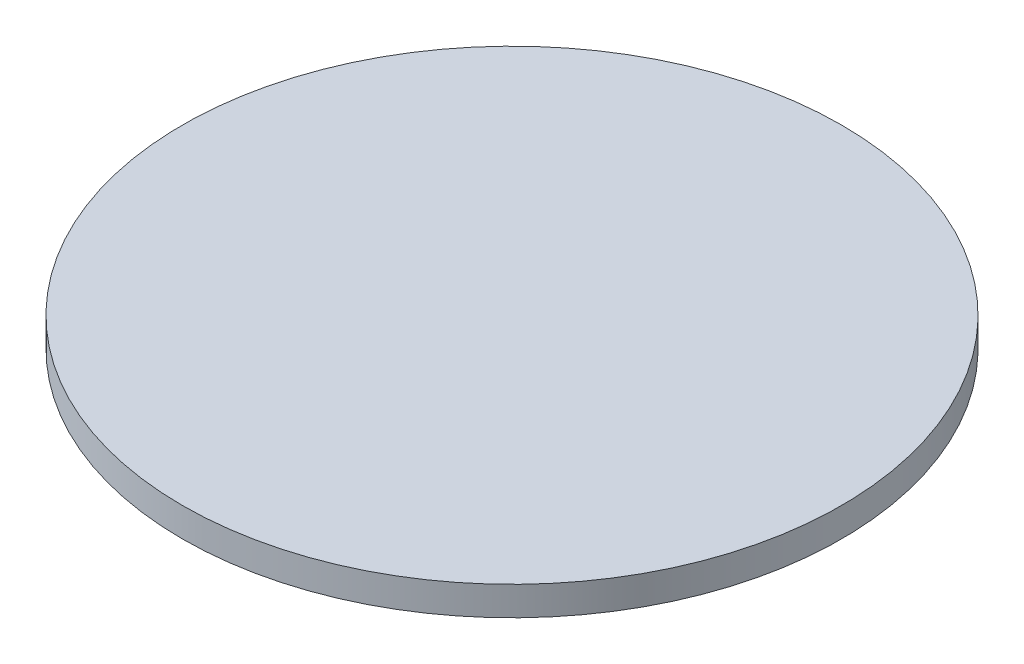
ISO-10303-21;
HEADER;
FILE_DESCRIPTION(('STEP AP214'),'2;1');
FILE_NAME('part.step','',(''),(''),'','','');
FILE_SCHEMA(('AUTOMOTIVE_DESIGN { 1 0 10303 214 1 1 1 1 }'));
ENDSEC;
DATA;
#1=APPLICATION_CONTEXT('core data for automotive mechanical design processes');
#2=APPLICATION_PROTOCOL_DEFINITION('international standard','automotive_design',2000,#1);
#3=PRODUCT_CONTEXT('',#1,'mechanical');
#4=PRODUCT('Part','Part','',(#3));
#5=PRODUCT_RELATED_PRODUCT_CATEGORY('part','',(#4));
#6=PRODUCT_DEFINITION_FORMATION('','',#4);
#7=PRODUCT_DEFINITION_CONTEXT('part definition',#1,'design');
#8=PRODUCT_DEFINITION('design','',#6,#7);
#9=PRODUCT_DEFINITION_SHAPE('','',#8);
#10=(LENGTH_UNIT() NAMED_UNIT(*) SI_UNIT(.MILLI.,.METRE.));
#11=(NAMED_UNIT(*) PLANE_ANGLE_UNIT() SI_UNIT($,.RADIAN.));
#12=(NAMED_UNIT(*) SI_UNIT($,.STERADIAN.) SOLID_ANGLE_UNIT());
#13=UNCERTAINTY_MEASURE_WITH_UNIT(LENGTH_MEASURE(1.E-05),#10,'distance_accuracy_value','');
#14=(GEOMETRIC_REPRESENTATION_CONTEXT(3) GLOBAL_UNCERTAINTY_ASSIGNED_CONTEXT((#13)) GLOBAL_UNIT_ASSIGNED_CONTEXT((#10,
#11,#12)) REPRESENTATION_CONTEXT('',''));
#15=CARTESIAN_POINT('',(0.,0.,0.));
#16=DIRECTION('',(0.,0.,1.));
#17=DIRECTION('',(1.,0.,0.));
#18=AXIS2_PLACEMENT_3D('',#15,#16,#17);
#19=CARTESIAN_POINT('',(12.5,1.1,-12.5));
#20=DIRECTION('',(0.,-1.,0.));
#21=DIRECTION('',(0.,0.,-1.));
#22=AXIS2_PLACEMENT_3D('',#19,#20,#21);
#23=CYLINDRICAL_SURFACE('',#22,12.5);
#24=CARTESIAN_POINT('',(12.5,1.1,-12.5));
#25=DIRECTION('',(0.,1.,0.));
#26=DIRECTION('',(0.,0.,1.));
#27=AXIS2_PLACEMENT_3D('',#24,#25,#26);
#28=CIRCLE('',#27,12.5);
#29=CARTESIAN_POINT('',(12.5,1.1,0.));
#30=VERTEX_POINT('',#29);
#31=EDGE_CURVE('E10',#30,#30,#28,.T.);
#32=ORIENTED_EDGE('',*,*,#31,.F.);
#33=EDGE_LOOP('',(#32));
#34=FACE_BOUND('',#33,.T.);
#35=CARTESIAN_POINT('',(12.5,0.,-12.5));
#36=DIRECTION('',(0.,1.,0.));
#37=DIRECTION('',(0.,0.,1.));
#38=AXIS2_PLACEMENT_3D('',#35,#36,#37);
#39=CIRCLE('',#38,12.5);
#40=CARTESIAN_POINT('',(12.5,0.,0.));
#41=VERTEX_POINT('',#40);
#42=EDGE_CURVE('E38',#41,#41,#39,.T.);
#43=ORIENTED_EDGE('',*,*,#42,.T.);
#44=EDGE_LOOP('',(#43));
#45=FACE_BOUND('',#44,.T.);
#46=ADVANCED_FACE('F35',(#34,#45),#23,.T.);
#47=CARTESIAN_POINT('',(12.5,1.1,-12.5));
#48=DIRECTION('',(0.,1.,0.));
#49=DIRECTION('',(0.,0.,1.));
#50=AXIS2_PLACEMENT_3D('',#47,#48,#49);
#51=PLANE('',#50);
#52=ORIENTED_EDGE('',*,*,#31,.T.);
#53=EDGE_LOOP('',(#52));
#54=FACE_BOUND('',#53,.T.);
#55=ADVANCED_FACE('F50',(#54),#51,.T.);
#56=CARTESIAN_POINT('',(12.5,0.,-12.5));
#57=DIRECTION('',(0.,1.,0.));
#58=DIRECTION('',(0.,0.,1.));
#59=AXIS2_PLACEMENT_3D('',#56,#57,#58);
#60=PLANE('',#59);
#61=ORIENTED_EDGE('',*,*,#42,.F.);
#62=EDGE_LOOP('',(#61));
#63=FACE_BOUND('',#62,.T.);
#64=ADVANCED_FACE('F48',(#63),#60,.F.);
#65=CLOSED_SHELL('',(#46,#55,#64));
#66=MANIFOLD_SOLID_BREP('B2',#65);
#67=ADVANCED_BREP_SHAPE_REPRESENTATION('',(#18,#66),#14);
#68=SHAPE_DEFINITION_REPRESENTATION(#9,#67);
ENDSEC;
END-ISO-10303-21;
